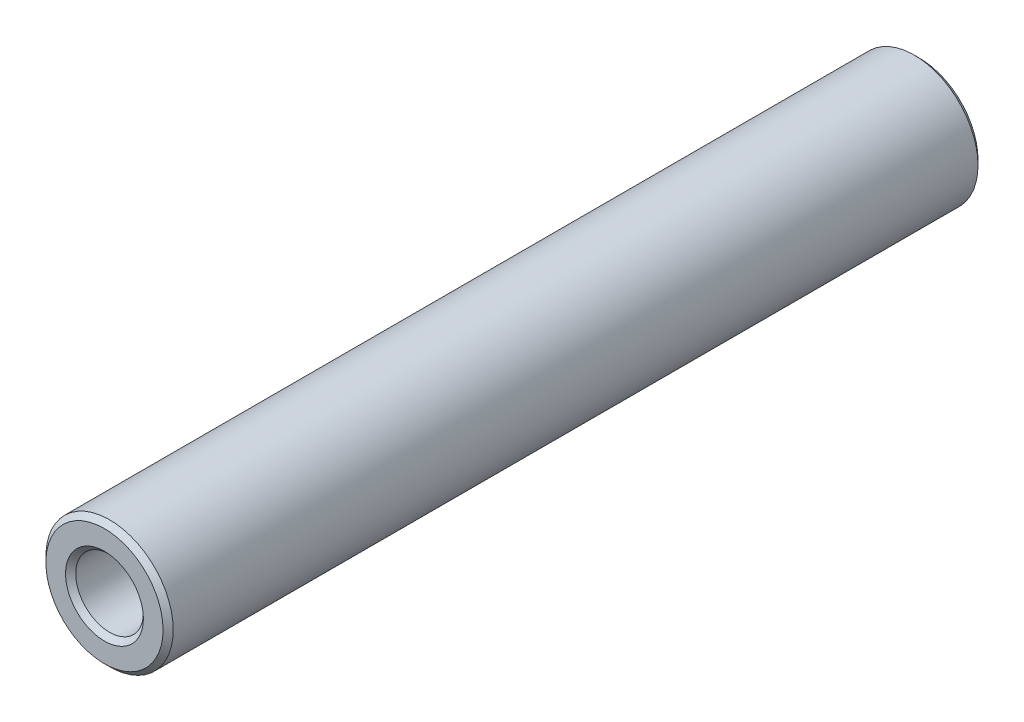
ISO-10303-21;
HEADER;
FILE_DESCRIPTION(('STEP AP214'),'2;1');
FILE_NAME('part.step','',(''),(''),'','','');
FILE_SCHEMA(('AUTOMOTIVE_DESIGN { 1 0 10303 214 1 1 1 1 }'));
ENDSEC;
DATA;
#1=APPLICATION_CONTEXT('core data for automotive mechanical design processes');
#2=APPLICATION_PROTOCOL_DEFINITION('international standard','automotive_design',2000,#1);
#3=PRODUCT_CONTEXT('',#1,'mechanical');
#4=PRODUCT('Part','Part','',(#3));
#5=PRODUCT_RELATED_PRODUCT_CATEGORY('part','',(#4));
#6=PRODUCT_DEFINITION_FORMATION('','',#4);
#7=PRODUCT_DEFINITION_CONTEXT('part definition',#1,'design');
#8=PRODUCT_DEFINITION('design','',#6,#7);
#9=PRODUCT_DEFINITION_SHAPE('','',#8);
#10=(LENGTH_UNIT() NAMED_UNIT(*) SI_UNIT(.MILLI.,.METRE.));
#11=(NAMED_UNIT(*) PLANE_ANGLE_UNIT() SI_UNIT($,.RADIAN.));
#12=(NAMED_UNIT(*) SI_UNIT($,.STERADIAN.) SOLID_ANGLE_UNIT());
#13=UNCERTAINTY_MEASURE_WITH_UNIT(LENGTH_MEASURE(1.E-05),#10,'distance_accuracy_value','');
#14=(GEOMETRIC_REPRESENTATION_CONTEXT(3) GLOBAL_UNCERTAINTY_ASSIGNED_CONTEXT((#13)) GLOBAL_UNIT_ASSIGNED_CONTEXT((#10,
#11,#12)) REPRESENTATION_CONTEXT('',''));
#15=CARTESIAN_POINT('',(0.,0.,0.));
#16=DIRECTION('',(0.,0.,1.));
#17=DIRECTION('',(1.,0.,0.));
#18=AXIS2_PLACEMENT_3D('',#15,#16,#17);
#19=CARTESIAN_POINT('',(0.,0.,-25.4));
#20=DIRECTION('',(0.,0.,1.));
#21=DIRECTION('',(1.,0.,0.));
#22=AXIS2_PLACEMENT_3D('',#19,#20,#21);
#23=CYLINDRICAL_SURFACE('',#22,3.96875);
#24=CARTESIAN_POINT('',(0.,0.,-25.0825));
#25=DIRECTION('',(0.,0.,1.));
#26=DIRECTION('',(1.,0.,0.));
#27=AXIS2_PLACEMENT_3D('',#24,#25,#26);
#28=CIRCLE('',#27,3.96875);
#29=CARTESIAN_POINT('',(3.96875,0.,-25.0825));
#30=VERTEX_POINT('',#29);
#31=EDGE_CURVE('E10',#30,#30,#28,.T.);
#32=ORIENTED_EDGE('',*,*,#31,.T.);
#33=EDGE_LOOP('',(#32));
#34=FACE_BOUND('',#33,.T.);
#35=CARTESIAN_POINT('',(0.,0.,25.0825));
#36=DIRECTION('',(0.,0.,1.));
#37=DIRECTION('',(1.,0.,0.));
#38=AXIS2_PLACEMENT_3D('',#35,#36,#37);
#39=CIRCLE('',#38,3.96875);
#40=CARTESIAN_POINT('',(3.96875,0.,25.0825));
#41=VERTEX_POINT('',#40);
#42=EDGE_CURVE('E37',#41,#41,#39,.F.);
#43=ORIENTED_EDGE('',*,*,#42,.T.);
#44=EDGE_LOOP('',(#43));
#45=FACE_BOUND('',#44,.T.);
#46=ADVANCED_FACE('F30',(#34,#45),#23,.T.);
#47=CARTESIAN_POINT('',(0.,0.,-25.4));
#48=DIRECTION('',(0.,0.,1.));
#49=DIRECTION('',(1.,0.,0.));
#50=AXIS2_PLACEMENT_3D('',#47,#48,#49);
#51=PLANE('',#50);
#52=CARTESIAN_POINT('',(0.,0.,-25.4));
#53=DIRECTION('',(0.,0.,1.));
#54=DIRECTION('',(1.,0.,0.));
#55=AXIS2_PLACEMENT_3D('',#52,#53,#54);
#56=CIRCLE('',#55,2.4257);
#57=CARTESIAN_POINT('',(2.4257,0.,-25.4));
#58=VERTEX_POINT('',#57);
#59=EDGE_CURVE('E56',#58,#58,#56,.T.);
#60=ORIENTED_EDGE('',*,*,#59,.T.);
#61=EDGE_LOOP('',(#60));
#62=FACE_BOUND('',#61,.T.);
#63=CARTESIAN_POINT('',(0.,0.,-25.4));
#64=DIRECTION('',(0.,0.,1.));
#65=DIRECTION('',(1.,0.,0.));
#66=AXIS2_PLACEMENT_3D('',#63,#64,#65);
#67=CIRCLE('',#66,3.65125000000001);
#68=CARTESIAN_POINT('',(3.65125000000001,0.,-25.4));
#69=VERTEX_POINT('',#68);
#70=EDGE_CURVE('E59',#69,#69,#67,.F.);
#71=ORIENTED_EDGE('',*,*,#70,.T.);
#72=EDGE_LOOP('',(#71));
#73=FACE_BOUND('',#72,.T.);
#74=ADVANCED_FACE('F63',(#62,#73),#51,.F.);
#75=CARTESIAN_POINT('',(0.,0.,-25.4));
#76=DIRECTION('',(0.,0.,1.));
#77=DIRECTION('',(1.,0.,0.));
#78=AXIS2_PLACEMENT_3D('',#75,#76,#77);
#79=CYLINDRICAL_SURFACE('',#78,2.1082);
#80=CARTESIAN_POINT('',(0.,0.,-25.0825));
#81=DIRECTION('',(0.,0.,1.));
#82=DIRECTION('',(1.,0.,0.));
#83=AXIS2_PLACEMENT_3D('',#80,#81,#82);
#84=CIRCLE('',#83,2.1082);
#85=CARTESIAN_POINT('',(2.1082,0.,-25.0825));
#86=VERTEX_POINT('',#85);
#87=EDGE_CURVE('E50',#86,#86,#84,.F.);
#88=ORIENTED_EDGE('',*,*,#87,.T.);
#89=EDGE_LOOP('',(#88));
#90=FACE_BOUND('',#89,.T.);
#91=CARTESIAN_POINT('',(0.,0.,25.0825));
#92=DIRECTION('',(0.,0.,1.));
#93=DIRECTION('',(1.,0.,0.));
#94=AXIS2_PLACEMENT_3D('',#91,#92,#93);
#95=CIRCLE('',#94,2.1082);
#96=CARTESIAN_POINT('',(2.1082,0.,25.0825));
#97=VERTEX_POINT('',#96);
#98=EDGE_CURVE('E53',#97,#97,#95,.T.);
#99=ORIENTED_EDGE('',*,*,#98,.T.);
#100=EDGE_LOOP('',(#99));
#101=FACE_BOUND('',#100,.T.);
#102=ADVANCED_FACE('F82',(#90,#101),#79,.F.);
#103=CARTESIAN_POINT('',(0.,0.,25.4));
#104=DIRECTION('',(0.,0.,1.));
#105=DIRECTION('',(1.,0.,0.));
#106=AXIS2_PLACEMENT_3D('',#103,#104,#105);
#107=PLANE('',#106);
#108=CARTESIAN_POINT('',(0.,0.,25.4));
#109=DIRECTION('',(0.,0.,1.));
#110=DIRECTION('',(1.,0.,0.));
#111=AXIS2_PLACEMENT_3D('',#108,#109,#110);
#112=CIRCLE('',#111,2.42570000000001);
#113=CARTESIAN_POINT('',(2.42570000000001,0.,25.4));
#114=VERTEX_POINT('',#113);
#115=EDGE_CURVE('E41',#114,#114,#112,.F.);
#116=ORIENTED_EDGE('',*,*,#115,.T.);
#117=EDGE_LOOP('',(#116));
#118=FACE_BOUND('',#117,.T.);
#119=CARTESIAN_POINT('',(0.,0.,25.4));
#120=DIRECTION('',(0.,0.,1.));
#121=DIRECTION('',(1.,0.,0.));
#122=AXIS2_PLACEMENT_3D('',#119,#120,#121);
#123=CIRCLE('',#122,3.65125);
#124=CARTESIAN_POINT('',(3.65125,0.,25.4));
#125=VERTEX_POINT('',#124);
#126=EDGE_CURVE('E45',#125,#125,#123,.T.);
#127=ORIENTED_EDGE('',*,*,#126,.T.);
#128=EDGE_LOOP('',(#127));
#129=FACE_BOUND('',#128,.T.);
#130=ADVANCED_FACE('F88',(#118,#129),#107,.T.);
#131=CARTESIAN_POINT('',(0.,0.,-25.4));
#132=DIRECTION('',(0.,0.,-1.));
#133=DIRECTION('',(-1.,0.,0.));
#134=AXIS2_PLACEMENT_3D('',#131,#132,#133);
#135=CONICAL_SURFACE('',#134,2.4257,0.785398163397455);
#136=ORIENTED_EDGE('',*,*,#87,.F.);
#137=EDGE_LOOP('',(#136));
#138=FACE_BOUND('',#137,.T.);
#139=ORIENTED_EDGE('',*,*,#59,.F.);
#140=EDGE_LOOP('',(#139));
#141=FACE_BOUND('',#140,.T.);
#142=ADVANCED_FACE('F74',(#138,#141),#135,.F.);
#143=CARTESIAN_POINT('',(0.,0.,25.0825));
#144=DIRECTION('',(0.,0.,1.));
#145=DIRECTION('',(1.,0.,0.));
#146=AXIS2_PLACEMENT_3D('',#143,#144,#145);
#147=CONICAL_SURFACE('',#146,2.1082,0.785398163397444);
#148=ORIENTED_EDGE('',*,*,#115,.F.);
#149=EDGE_LOOP('',(#148));
#150=FACE_BOUND('',#149,.T.);
#151=ORIENTED_EDGE('',*,*,#98,.F.);
#152=EDGE_LOOP('',(#151));
#153=FACE_BOUND('',#152,.T.);
#154=ADVANCED_FACE('F68',(#150,#153),#147,.F.);
#155=CARTESIAN_POINT('',(0.,0.,-25.0825));
#156=DIRECTION('',(0.,0.,1.));
#157=DIRECTION('',(1.,0.,0.));
#158=AXIS2_PLACEMENT_3D('',#155,#156,#157);
#159=CONICAL_SURFACE('',#158,3.96875,0.785398163397437);
#160=ORIENTED_EDGE('',*,*,#70,.F.);
#161=EDGE_LOOP('',(#160));
#162=FACE_BOUND('',#161,.T.);
#163=ORIENTED_EDGE('',*,*,#31,.F.);
#164=EDGE_LOOP('',(#163));
#165=FACE_BOUND('',#164,.T.);
#166=ADVANCED_FACE('F65',(#162,#165),#159,.T.);
#167=CARTESIAN_POINT('',(0.,0.,25.4));
#168=DIRECTION('',(0.,0.,-1.));
#169=DIRECTION('',(-1.,0.,0.));
#170=AXIS2_PLACEMENT_3D('',#167,#168,#169);
#171=CONICAL_SURFACE('',#170,3.65125,0.785398163397448);
#172=ORIENTED_EDGE('',*,*,#42,.F.);
#173=EDGE_LOOP('',(#172));
#174=FACE_BOUND('',#173,.T.);
#175=ORIENTED_EDGE('',*,*,#126,.F.);
#176=EDGE_LOOP('',(#175));
#177=FACE_BOUND('',#176,.T.);
#178=ADVANCED_FACE('F32',(#174,#177),#171,.T.);
#179=CLOSED_SHELL('',(#46,#74,#102,#130,#142,#154,#166,#178));
#180=MANIFOLD_SOLID_BREP('B2',#179);
#181=ADVANCED_BREP_SHAPE_REPRESENTATION('',(#18,#180),#14);
#182=SHAPE_DEFINITION_REPRESENTATION(#9,#181);
ENDSEC;
END-ISO-10303-21;
